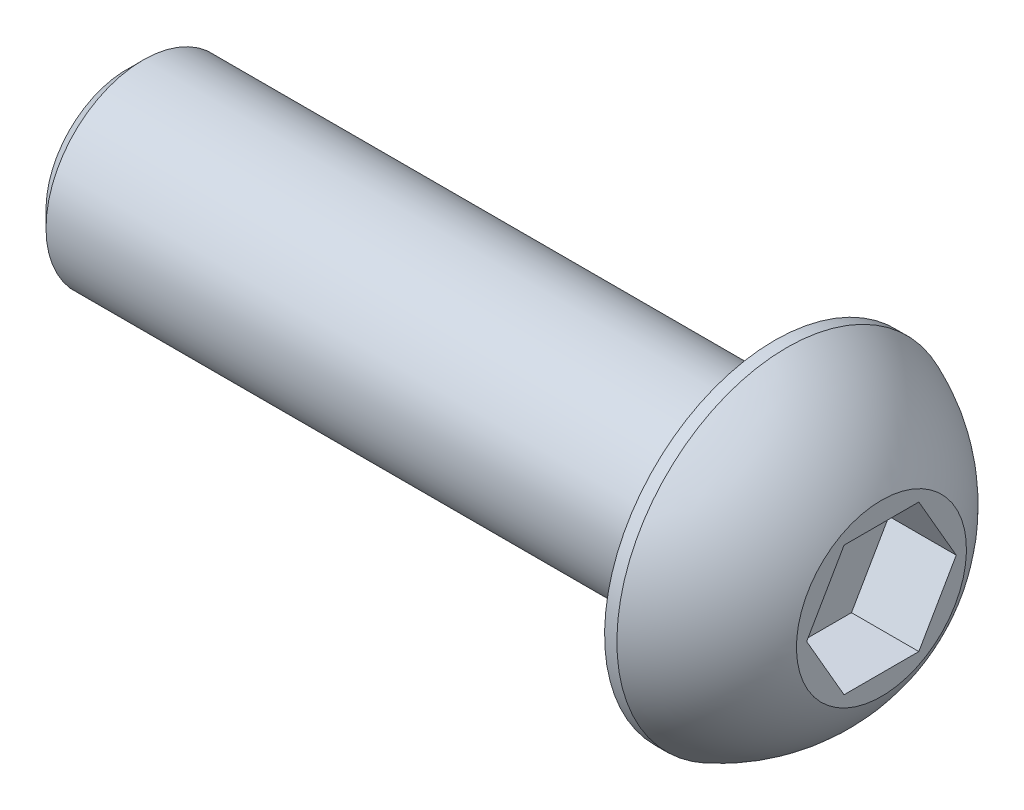
ISO-10303-21;
HEADER;
FILE_DESCRIPTION(('STEP AP214'),'2;1');
FILE_NAME('part.step','',(''),(''),'','','');
FILE_SCHEMA(('AUTOMOTIVE_DESIGN { 1 0 10303 214 1 1 1 1 }'));
ENDSEC;
DATA;
#1=APPLICATION_CONTEXT('core data for automotive mechanical design processes');
#2=APPLICATION_PROTOCOL_DEFINITION('international standard','automotive_design',2000,#1);
#3=PRODUCT_CONTEXT('',#1,'mechanical');
#4=PRODUCT('Part','Part','',(#3));
#5=PRODUCT_RELATED_PRODUCT_CATEGORY('part','',(#4));
#6=PRODUCT_DEFINITION_FORMATION('','',#4);
#7=PRODUCT_DEFINITION_CONTEXT('part definition',#1,'design');
#8=PRODUCT_DEFINITION('design','',#6,#7);
#9=PRODUCT_DEFINITION_SHAPE('','',#8);
#10=(LENGTH_UNIT() NAMED_UNIT(*) SI_UNIT(.MILLI.,.METRE.));
#11=(NAMED_UNIT(*) PLANE_ANGLE_UNIT() SI_UNIT($,.RADIAN.));
#12=(NAMED_UNIT(*) SI_UNIT($,.STERADIAN.) SOLID_ANGLE_UNIT());
#13=UNCERTAINTY_MEASURE_WITH_UNIT(LENGTH_MEASURE(1.E-05),#10,'distance_accuracy_value','');
#14=(GEOMETRIC_REPRESENTATION_CONTEXT(3) GLOBAL_UNCERTAINTY_ASSIGNED_CONTEXT((#13)) GLOBAL_UNIT_ASSIGNED_CONTEXT((#10,
#11,#12)) REPRESENTATION_CONTEXT('',''));
#15=CARTESIAN_POINT('',(0.,0.,0.));
#16=DIRECTION('',(0.,0.,1.));
#17=DIRECTION('',(1.,0.,0.));
#18=AXIS2_PLACEMENT_3D('',#15,#16,#17);
#19=CARTESIAN_POINT('',(0.,0.,0.));
#20=DIRECTION('',(1.,0.,0.));
#21=DIRECTION('',(0.,1.,0.));
#22=AXIS2_PLACEMENT_3D('',#19,#20,#21);
#23=PLANE('',#22);
#24=DIRECTION('',(0.,0.866025403784439,-0.5));
#25=VECTOR('',#24,1.);
#26=CARTESIAN_POINT('',(0.,-2.,-1.15470053837925));
#27=LINE('',#26,#25);
#28=CARTESIAN_POINT('',(0.,-2.,-1.15470053837925));
#29=VERTEX_POINT('',#28);
#30=CARTESIAN_POINT('',(0.,0.,-2.3094010767585));
#31=VERTEX_POINT('',#30);
#32=EDGE_CURVE('E49',#29,#31,#27,.T.);
#33=ORIENTED_EDGE('',*,*,#32,.F.);
#34=DIRECTION('',(0.,0.,-1.));
#35=VECTOR('',#34,1.);
#36=CARTESIAN_POINT('',(0.,-2.,1.15470053837925));
#37=LINE('',#36,#35);
#38=CARTESIAN_POINT('',(0.,-2.,1.15470053837925));
#39=VERTEX_POINT('',#38);
#40=EDGE_CURVE('E132',#39,#29,#37,.T.);
#41=ORIENTED_EDGE('',*,*,#40,.F.);
#42=DIRECTION('',(0.,-0.866025403784439,-0.5));
#43=VECTOR('',#42,1.);
#44=CARTESIAN_POINT('',(0.,0.,2.3094010767585));
#45=LINE('',#44,#43);
#46=CARTESIAN_POINT('',(0.,0.,2.3094010767585));
#47=VERTEX_POINT('',#46);
#48=EDGE_CURVE('E130',#47,#39,#45,.T.);
#49=ORIENTED_EDGE('',*,*,#48,.F.);
#50=DIRECTION('',(0.,-0.866025403784439,0.5));
#51=VECTOR('',#50,1.);
#52=CARTESIAN_POINT('',(0.,2.,1.15470053837925));
#53=LINE('',#52,#51);
#54=CARTESIAN_POINT('',(0.,2.,1.15470053837925));
#55=VERTEX_POINT('',#54);
#56=EDGE_CURVE('E97',#55,#47,#53,.T.);
#57=ORIENTED_EDGE('',*,*,#56,.F.);
#58=DIRECTION('',(0.,0.,1.));
#59=VECTOR('',#58,1.);
#60=CARTESIAN_POINT('',(0.,2.,-1.15470053837925));
#61=LINE('',#60,#59);
#62=CARTESIAN_POINT('',(0.,2.,-1.15470053837925));
#63=VERTEX_POINT('',#62);
#64=EDGE_CURVE('E126',#63,#55,#61,.T.);
#65=ORIENTED_EDGE('',*,*,#64,.F.);
#66=DIRECTION('',(0.,0.866025403784438,0.5));
#67=VECTOR('',#66,1.);
#68=CARTESIAN_POINT('',(0.,0.,-2.3094010767585));
#69=LINE('',#68,#67);
#70=EDGE_CURVE('E123',#31,#63,#69,.T.);
#71=ORIENTED_EDGE('',*,*,#70,.F.);
#72=EDGE_LOOP('',(#33,#41,#49,#57,#65,#71));
#73=FACE_BOUND('',#72,.T.);
#74=CARTESIAN_POINT('',(0.,0.,0.));
#75=DIRECTION('',(1.,0.,0.));
#76=DIRECTION('',(0.,1.,0.));
#77=AXIS2_PLACEMENT_3D('',#74,#75,#76);
#78=CIRCLE('',#77,2.625);
#79=CARTESIAN_POINT('',(0.,2.625,0.));
#80=VERTEX_POINT('',#79);
#81=EDGE_CURVE('E150',#80,#80,#78,.T.);
#82=ORIENTED_EDGE('',*,*,#81,.T.);
#83=EDGE_LOOP('',(#82));
#84=FACE_BOUND('',#83,.T.);
#85=ADVANCED_FACE('F34',(#73,#84),#23,.T.);
#86=CARTESIAN_POINT('',(-4.99970462328767,0.,0.));
#87=DIRECTION('',(1.,0.,0.));
#88=DIRECTION('',(0.,1.,0.));
#89=AXIS2_PLACEMENT_3D('',#86,#87,#88);
#90=SPHERICAL_SURFACE('',#89,5.64691697478581);
#91=CARTESIAN_POINT('',(-2.92,0.,0.));
#92=DIRECTION('',(1.,0.,0.));
#93=DIRECTION('',(0.,1.,0.));
#94=AXIS2_PLACEMENT_3D('',#91,#92,#93);
#95=CIRCLE('',#94,5.25);
#96=CARTESIAN_POINT('',(-2.92,5.25,0.));
#97=VERTEX_POINT('',#96);
#98=EDGE_CURVE('E147',#97,#97,#95,.T.);
#99=CARTESIAN_POINT('',(-2.92,5.25,0.));
#100=CARTESIAN_POINT('',(-2.88116333139993,5.23461555496798,0.));
#101=CARTESIAN_POINT('',(-2.84249743445724,5.21880002304115,0.));
#102=CARTESIAN_POINT('',(-2.76552608609883,5.18631490596423,0.));
#103=CARTESIAN_POINT('',(-2.72722063468312,5.16964532081416,0.));
#104=CARTESIAN_POINT('',(-2.65098907959087,5.13546021785716,0.));
#105=CARTESIAN_POINT('',(-2.61306297591435,5.11794470005024,0.));
#106=CARTESIAN_POINT('',(-2.5376087841269,5.08207638165227,0.));
#107=CARTESIAN_POINT('',(-2.50008069601598,5.06372358106121,0.));
#108=CARTESIAN_POINT('',(-2.42544101991594,5.02618972911532,0.));
#109=CARTESIAN_POINT('',(-2.38832943192682,5.00700867776048,0.));
#110=CARTESIAN_POINT('',(-2.31454103209333,4.9678277722965,0.));
#111=CARTESIAN_POINT('',(-2.27786422024896,4.94782791818736,0.));
#112=CARTESIAN_POINT('',(-2.204963435524,4.90701925630077,0.));
#113=CARTESIAN_POINT('',(-2.16873946264342,4.88621044852334,0.));
#114=CARTESIAN_POINT('',(-2.09676219540545,4.84379412736126,0.));
#115=CARTESIAN_POINT('',(-2.06100890104806,4.82218661397662,0.));
#116=CARTESIAN_POINT('',(-1.9899905986814,4.77818352285276,0.));
#117=CARTESIAN_POINT('',(-1.95472559067213,4.75578794511354,0.));
#118=CARTESIAN_POINT('',(-1.88470122833741,4.71021975468139,0.));
#119=CARTESIAN_POINT('',(-1.84994187401195,4.68704714198848,0.));
#120=CARTESIAN_POINT('',(-1.78094593736053,4.63993629371345,0.));
#121=CARTESIAN_POINT('',(-1.74670935503456,4.61599805813134,0.));
#122=CARTESIAN_POINT('',(-1.67877582324134,4.56736775320002,0.));
#123=CARTESIAN_POINT('',(-1.6450788737741,4.54267568385081,0.));
#124=CARTESIAN_POINT('',(-1.57824120279908,4.4925498717552,0.));
#125=CARTESIAN_POINT('',(-1.5451004812913,4.4671161290088,0.));
#126=CARTESIAN_POINT('',(-1.4793915874043,4.4155194957489,0.));
#127=CARTESIAN_POINT('',(-1.44682341502507,4.38935660523539,0.));
#128=CARTESIAN_POINT('',(-1.3822756585948,4.33631456116252,0.));
#129=CARTESIAN_POINT('',(-1.35029607454375,4.30943540760316,0.));
#130=CARTESIAN_POINT('',(-1.28694124410103,4.2549740749057,0.));
#131=CARTESIAN_POINT('',(-1.25556599770935,4.22739189576759,0.));
#132=CARTESIAN_POINT('',(-1.19343529429185,4.17153809560631,0.));
#133=CARTESIAN_POINT('',(-1.16267983726602,4.14326647458313,0.));
#134=CARTESIAN_POINT('',(-1.10180385905236,4.0860477138823,0.));
#135=CARTESIAN_POINT('',(-1.07168333786451,4.05710057420464,0.));
#136=CARTESIAN_POINT('',(-1.01209206510522,3.99854503210538,0.));
#137=CARTESIAN_POINT('',(-0.982621313533777,3.96893662968379,0.));
#138=CARTESIAN_POINT('',(-0.924344093786624,3.90907314366641,0.));
#139=CARTESIAN_POINT('',(-0.895537625610918,3.87881806007063,0.));
#140=CARTESIAN_POINT('',(-0.838603159287821,3.8176761117527,0.));
#141=CARTESIAN_POINT('',(-0.810475161140431,3.78678924703054,0.));
#142=CARTESIAN_POINT('',(-0.754911487372876,3.72439894764781,0.));
#143=CARTESIAN_POINT('',(-0.727475811752712,3.69289551298725,0.));
#144=CARTESIAN_POINT('',(-0.67331029458373,3.62928758856413,0.));
#145=CARTESIAN_POINT('',(-0.646580453034913,3.59718309880158,0.));
#146=CARTESIAN_POINT('',(-0.593839767940168,3.53238887502059,0.));
#147=CARTESIAN_POINT('',(-0.567828924394241,3.49969914100215,0.));
#148=CARTESIAN_POINT('',(-0.516539045154724,3.43375052777114,0.));
#149=CARTESIAN_POINT('',(-0.491260009461134,3.40049164855857,0.));
#150=CARTESIAN_POINT('',(-0.441446195334814,3.33342112431611,0.));
#151=CARTESIAN_POINT('',(-0.416911416902083,3.29960947928621,0.));
#152=CARTESIAN_POINT('',(-0.368598200321403,3.23145007493057,0.));
#153=CARTESIAN_POINT('',(-0.344819762173455,3.19710231560482,0.));
#154=CARTESIAN_POINT('',(-0.298030936151541,3.12788759851044,0.));
#155=CARTESIAN_POINT('',(-0.275020548277576,3.09302064074179,0.));
#156=CARTESIAN_POINT('',(-0.229779156601616,3.02278469716988,0.));
#157=CARTESIAN_POINT('',(-0.20754815279962,2.98741571136661,0.));
#158=CARTESIAN_POINT('',(-0.16387647155035,2.91619313362712,0.));
#159=CARTESIAN_POINT('',(-0.142435794103075,2.8803395416909,0.));
#160=CARTESIAN_POINT('',(-0.100355347300804,2.80816539636944,0.));
#161=CARTESIAN_POINT('',(-0.0797155779458063,2.7718448429842,0.));
#162=CARTESIAN_POINT('',(-0.039247027615892,2.69875470867178,0.));
#163=CARTESIAN_POINT('',(-0.0194182466409751,2.6619851277446,0.));
#164=CARTESIAN_POINT('',(0.,2.625,0.));
#165=B_SPLINE_CURVE_WITH_KNOTS('',3,(#99,#100,#101,#102,#103,#104,#105,#106,#107,#108,#109,#110,
#111,#112,#113,#114,#115,#116,#117,#118,#119,#120,#121,#122,#123,#124,#125,#126,#127,#128,#129,
#130,#131,#132,#133,#134,#135,#136,#137,#138,#139,#140,#141,#142,#143,#144,#145,#146,#147,#148,
#149,#150,#151,#152,#153,#154,#155,#156,#157,#158,#159,#160,#161,#162,#163,#164),.UNSPECIFIED.,
.F.,.F.,(4,2,2,2,2,2,2,2,2,2,2,2,2,2,2,2,2,2,2,2,2,2,2,2,2,2,2,2,2,2,2,2,4),(0.,
0.12531586463099,0.25063172926198,0.37594759389297,0.501263458523959,0.626579323154949,
0.751895187785939,0.877211052416929,1.00252691704792,1.12784278167891,1.2531586463099,
1.37847451094089,1.50379037557188,1.62910624020287,1.75442210483386,1.87973796946485,
2.00505383409584,2.13036969872683,2.25568556335782,2.38100142798881,2.5063172926198,
2.63163315725079,2.75694902188178,2.88226488651277,3.00758075114376,3.13289661577475,
3.25821248040574,3.38352834503673,3.50884420966772,3.63416007429871,3.7594759389297,
3.88479180356069,4.01010766819168),.UNSPECIFIED.);
#166=EDGE_CURVE('BSEAM167',#97,#80,#165,.T.);
#167=ORIENTED_EDGE('',*,*,#98,.T.);
#168=ORIENTED_EDGE('',*,*,#81,.F.);
#169=ORIENTED_EDGE('',*,*,#166,.T.);
#170=ORIENTED_EDGE('',*,*,#166,.F.);
#171=EDGE_LOOP('',(#167,#169,#168,#170));
#172=FACE_BOUND('',#171,.T.);
#173=ADVANCED_FACE('F167',(#172),#90,.T.);
#174=CARTESIAN_POINT('',(0.,0.,0.));
#175=DIRECTION('',(1.,0.,0.));
#176=DIRECTION('',(0.,1.,0.));
#177=AXIS2_PLACEMENT_3D('',#174,#175,#176);
#178=CYLINDRICAL_SURFACE('',#177,5.25);
#179=CARTESIAN_POINT('',(-3.3,0.,0.));
#180=DIRECTION('',(1.,0.,0.));
#181=DIRECTION('',(0.,1.,0.));
#182=AXIS2_PLACEMENT_3D('',#179,#180,#181);
#183=CIRCLE('',#182,5.25);
#184=CARTESIAN_POINT('',(-3.3,5.25,0.));
#185=VERTEX_POINT('',#184);
#186=EDGE_CURVE('E144',#185,#185,#183,.T.);
#187=ORIENTED_EDGE('',*,*,#186,.T.);
#188=EDGE_LOOP('',(#187));
#189=FACE_BOUND('',#188,.T.);
#190=ORIENTED_EDGE('',*,*,#98,.F.);
#191=EDGE_LOOP('',(#190));
#192=FACE_BOUND('',#191,.T.);
#193=ADVANCED_FACE('F172',(#189,#192),#178,.T.);
#194=CARTESIAN_POINT('',(-3.3,5.25,0.));
#195=DIRECTION('',(-1.,0.,0.));
#196=DIRECTION('',(0.,-1.,0.));
#197=AXIS2_PLACEMENT_3D('',#194,#195,#196);
#198=PLANE('',#197);
#199=CARTESIAN_POINT('',(-3.3,0.,0.));
#200=DIRECTION('',(1.,0.,0.));
#201=DIRECTION('',(0.,1.,0.));
#202=AXIS2_PLACEMENT_3D('',#199,#200,#201);
#203=CIRCLE('',#202,3.);
#204=CARTESIAN_POINT('',(-3.3,3.,0.));
#205=VERTEX_POINT('',#204);
#206=EDGE_CURVE('E136',#205,#205,#203,.T.);
#207=ORIENTED_EDGE('',*,*,#206,.T.);
#208=EDGE_LOOP('',(#207));
#209=FACE_BOUND('',#208,.T.);
#210=ORIENTED_EDGE('',*,*,#186,.F.);
#211=EDGE_LOOP('',(#210));
#212=FACE_BOUND('',#211,.T.);
#213=ADVANCED_FACE('F179',(#209,#212),#198,.T.);
#214=CARTESIAN_POINT('',(0.,0.,0.));
#215=DIRECTION('',(1.,0.,0.));
#216=DIRECTION('',(0.,1.,0.));
#217=AXIS2_PLACEMENT_3D('',#214,#215,#216);
#218=CYLINDRICAL_SURFACE('',#217,3.);
#219=CARTESIAN_POINT('',(-22.8,0.,0.));
#220=DIRECTION('',(-1.,0.,0.));
#221=DIRECTION('',(0.,-1.,0.));
#222=AXIS2_PLACEMENT_3D('',#219,#220,#221);
#223=CIRCLE('',#222,3.);
#224=CARTESIAN_POINT('',(-22.8,-3.,0.));
#225=VERTEX_POINT('',#224);
#226=EDGE_CURVE('E42',#225,#225,#223,.F.);
#227=ORIENTED_EDGE('',*,*,#226,.T.);
#228=EDGE_LOOP('',(#227));
#229=FACE_BOUND('',#228,.T.);
#230=ORIENTED_EDGE('',*,*,#206,.F.);
#231=EDGE_LOOP('',(#230));
#232=FACE_BOUND('',#231,.T.);
#233=ADVANCED_FACE('F155',(#229,#232),#218,.T.);
#234=CARTESIAN_POINT('',(-23.3,3.,0.));
#235=DIRECTION('',(-1.,0.,0.));
#236=DIRECTION('',(0.,-1.,0.));
#237=AXIS2_PLACEMENT_3D('',#234,#235,#236);
#238=PLANE('',#237);
#239=CARTESIAN_POINT('',(-23.3,0.,0.));
#240=DIRECTION('',(-1.,0.,0.));
#241=DIRECTION('',(0.,-1.,0.));
#242=AXIS2_PLACEMENT_3D('',#239,#240,#241);
#243=CIRCLE('',#242,2.5);
#244=CARTESIAN_POINT('',(-23.3,-2.5,0.));
#245=VERTEX_POINT('',#244);
#246=EDGE_CURVE('E11',#245,#245,#243,.T.);
#247=ORIENTED_EDGE('',*,*,#246,.T.);
#248=EDGE_LOOP('',(#247));
#249=FACE_BOUND('',#248,.T.);
#250=ADVANCED_FACE('F186',(#249),#238,.T.);
#251=CARTESIAN_POINT('',(-2.08,-2.,-1.15470053837925));
#252=DIRECTION('',(0.,-0.5,-0.866025403784439));
#253=DIRECTION('',(0.,0.866025403784439,-0.5));
#254=AXIS2_PLACEMENT_3D('',#251,#252,#253);
#255=PLANE('',#254);
#256=ORIENTED_EDGE('',*,*,#32,.T.);
#257=DIRECTION('',(1.,0.,0.));
#258=VECTOR('',#257,1.);
#259=CARTESIAN_POINT('',(-2.08,0.,-2.3094010767585));
#260=LINE('',#259,#258);
#261=CARTESIAN_POINT('',(-2.08,0.,-2.3094010767585));
#262=VERTEX_POINT('',#261);
#263=EDGE_CURVE('E79',#262,#31,#260,.T.);
#264=ORIENTED_EDGE('',*,*,#263,.F.);
#265=DIRECTION('',(0.,0.866025403784439,-0.5));
#266=VECTOR('',#265,1.);
#267=CARTESIAN_POINT('',(-2.08,-2.,-1.15470053837925));
#268=LINE('',#267,#266);
#269=CARTESIAN_POINT('',(-2.08,-2.,-1.15470053837925));
#270=VERTEX_POINT('',#269);
#271=EDGE_CURVE('E134',#270,#262,#268,.T.);
#272=ORIENTED_EDGE('',*,*,#271,.F.);
#273=DIRECTION('',(1.,0.,0.));
#274=VECTOR('',#273,1.);
#275=CARTESIAN_POINT('',(-2.08,-2.,-1.15470053837925));
#276=LINE('',#275,#274);
#277=EDGE_CURVE('E57',#270,#29,#276,.T.);
#278=ORIENTED_EDGE('',*,*,#277,.T.);
#279=EDGE_LOOP('',(#256,#264,#272,#278));
#280=FACE_BOUND('',#279,.T.);
#281=ADVANCED_FACE('F189',(#280),#255,.F.);
#282=CARTESIAN_POINT('',(-2.08,-2.,1.15470053837925));
#283=DIRECTION('',(0.,-1.,0.));
#284=DIRECTION('',(0.,0.,-1.));
#285=AXIS2_PLACEMENT_3D('',#282,#283,#284);
#286=PLANE('',#285);
#287=ORIENTED_EDGE('',*,*,#40,.T.);
#288=ORIENTED_EDGE('',*,*,#277,.F.);
#289=DIRECTION('',(0.,0.,-1.));
#290=VECTOR('',#289,1.);
#291=CARTESIAN_POINT('',(-2.08,-2.,1.15470053837925));
#292=LINE('',#291,#290);
#293=CARTESIAN_POINT('',(-2.08,-2.,1.15470053837925));
#294=VERTEX_POINT('',#293);
#295=EDGE_CURVE('E109',#294,#270,#292,.T.);
#296=ORIENTED_EDGE('',*,*,#295,.F.);
#297=DIRECTION('',(1.,0.,0.));
#298=VECTOR('',#297,1.);
#299=CARTESIAN_POINT('',(-2.08,-2.,1.15470053837925));
#300=LINE('',#299,#298);
#301=EDGE_CURVE('E101',#294,#39,#300,.T.);
#302=ORIENTED_EDGE('',*,*,#301,.T.);
#303=EDGE_LOOP('',(#287,#288,#296,#302));
#304=FACE_BOUND('',#303,.T.);
#305=ADVANCED_FACE('F193',(#304),#286,.F.);
#306=CARTESIAN_POINT('',(-2.08,0.,2.3094010767585));
#307=DIRECTION('',(0.,-0.5,0.866025403784439));
#308=DIRECTION('',(0.,-0.866025403784439,-0.5));
#309=AXIS2_PLACEMENT_3D('',#306,#307,#308);
#310=PLANE('',#309);
#311=ORIENTED_EDGE('',*,*,#48,.T.);
#312=ORIENTED_EDGE('',*,*,#301,.F.);
#313=DIRECTION('',(0.,-0.866025403784439,-0.5));
#314=VECTOR('',#313,1.);
#315=CARTESIAN_POINT('',(-2.08,0.,2.3094010767585));
#316=LINE('',#315,#314);
#317=CARTESIAN_POINT('',(-2.08,0.,2.3094010767585));
#318=VERTEX_POINT('',#317);
#319=EDGE_CURVE('E105',#318,#294,#316,.T.);
#320=ORIENTED_EDGE('',*,*,#319,.F.);
#321=DIRECTION('',(1.,0.,0.));
#322=VECTOR('',#321,1.);
#323=CARTESIAN_POINT('',(-2.08,0.,2.3094010767585));
#324=LINE('',#323,#322);
#325=EDGE_CURVE('E90',#318,#47,#324,.T.);
#326=ORIENTED_EDGE('',*,*,#325,.T.);
#327=EDGE_LOOP('',(#311,#312,#320,#326));
#328=FACE_BOUND('',#327,.T.);
#329=ADVANCED_FACE('F106',(#328),#310,.F.);
#330=CARTESIAN_POINT('',(-2.08,2.,1.15470053837925));
#331=DIRECTION('',(0.,0.5,0.866025403784439));
#332=DIRECTION('',(0.,-0.866025403784439,0.5));
#333=AXIS2_PLACEMENT_3D('',#330,#331,#332);
#334=PLANE('',#333);
#335=ORIENTED_EDGE('',*,*,#56,.T.);
#336=ORIENTED_EDGE('',*,*,#325,.F.);
#337=DIRECTION('',(0.,-0.866025403784439,0.5));
#338=VECTOR('',#337,1.);
#339=CARTESIAN_POINT('',(-2.08,2.,1.15470053837925));
#340=LINE('',#339,#338);
#341=CARTESIAN_POINT('',(-2.08,2.,1.15470053837925));
#342=VERTEX_POINT('',#341);
#343=EDGE_CURVE('E94',#342,#318,#340,.T.);
#344=ORIENTED_EDGE('',*,*,#343,.F.);
#345=DIRECTION('',(1.,0.,0.));
#346=VECTOR('',#345,1.);
#347=CARTESIAN_POINT('',(-2.08,2.,1.15470053837925));
#348=LINE('',#347,#346);
#349=EDGE_CURVE('E102',#342,#55,#348,.T.);
#350=ORIENTED_EDGE('',*,*,#349,.T.);
#351=EDGE_LOOP('',(#335,#336,#344,#350));
#352=FACE_BOUND('',#351,.T.);
#353=ADVANCED_FACE('F92',(#352),#334,.F.);
#354=CARTESIAN_POINT('',(-2.08,2.,-1.15470053837925));
#355=DIRECTION('',(0.,1.,0.));
#356=DIRECTION('',(-1.,0.,0.));
#357=AXIS2_PLACEMENT_3D('',#354,#355,#356);
#358=PLANE('',#357);
#359=ORIENTED_EDGE('',*,*,#64,.T.);
#360=ORIENTED_EDGE('',*,*,#349,.F.);
#361=DIRECTION('',(0.,0.,1.));
#362=VECTOR('',#361,1.);
#363=CARTESIAN_POINT('',(-2.08,2.,-1.15470053837925));
#364=LINE('',#363,#362);
#365=CARTESIAN_POINT('',(-2.08,2.,-1.15470053837925));
#366=VERTEX_POINT('',#365);
#367=EDGE_CURVE('E115',#366,#342,#364,.T.);
#368=ORIENTED_EDGE('',*,*,#367,.F.);
#369=DIRECTION('',(1.,0.,0.));
#370=VECTOR('',#369,1.);
#371=CARTESIAN_POINT('',(-2.08,2.,-1.15470053837925));
#372=LINE('',#371,#370);
#373=EDGE_CURVE('E139',#366,#63,#372,.T.);
#374=ORIENTED_EDGE('',*,*,#373,.T.);
#375=EDGE_LOOP('',(#359,#360,#368,#374));
#376=FACE_BOUND('',#375,.T.);
#377=ADVANCED_FACE('F196',(#376),#358,.F.);
#378=CARTESIAN_POINT('',(-2.08,0.,-2.3094010767585));
#379=DIRECTION('',(0.,0.5,-0.866025403784438));
#380=DIRECTION('',(0.,0.866025403784439,0.5));
#381=AXIS2_PLACEMENT_3D('',#378,#379,#380);
#382=PLANE('',#381);
#383=ORIENTED_EDGE('',*,*,#70,.T.);
#384=ORIENTED_EDGE('',*,*,#373,.F.);
#385=DIRECTION('',(0.,0.866025403784438,0.5));
#386=VECTOR('',#385,1.);
#387=CARTESIAN_POINT('',(-2.08,0.,-2.3094010767585));
#388=LINE('',#387,#386);
#389=EDGE_CURVE('E117',#262,#366,#388,.T.);
#390=ORIENTED_EDGE('',*,*,#389,.F.);
#391=ORIENTED_EDGE('',*,*,#263,.T.);
#392=EDGE_LOOP('',(#383,#384,#390,#391));
#393=FACE_BOUND('',#392,.T.);
#394=ADVANCED_FACE('F163',(#393),#382,.F.);
#395=CARTESIAN_POINT('',(-2.08,0.,-2.3094010767585));
#396=DIRECTION('',(1.,0.,0.));
#397=DIRECTION('',(0.,1.,0.));
#398=AXIS2_PLACEMENT_3D('',#395,#396,#397);
#399=PLANE('',#398);
#400=ORIENTED_EDGE('',*,*,#271,.T.);
#401=ORIENTED_EDGE('',*,*,#389,.T.);
#402=ORIENTED_EDGE('',*,*,#367,.T.);
#403=ORIENTED_EDGE('',*,*,#343,.T.);
#404=ORIENTED_EDGE('',*,*,#319,.T.);
#405=ORIENTED_EDGE('',*,*,#295,.T.);
#406=EDGE_LOOP('',(#400,#401,#402,#403,#404,#405));
#407=FACE_BOUND('',#406,.T.);
#408=ADVANCED_FACE('F112',(#407),#399,.T.);
#409=CARTESIAN_POINT('',(-22.8,0.,0.));
#410=DIRECTION('',(1.,0.,0.));
#411=DIRECTION('',(0.,1.,0.));
#412=AXIS2_PLACEMENT_3D('',#409,#410,#411);
#413=CONICAL_SURFACE('',#412,3.,0.785398163397449);
#414=ORIENTED_EDGE('',*,*,#246,.F.);
#415=EDGE_LOOP('',(#414));
#416=FACE_BOUND('',#415,.T.);
#417=ORIENTED_EDGE('',*,*,#226,.F.);
#418=EDGE_LOOP('',(#417));
#419=FACE_BOUND('',#418,.T.);
#420=ADVANCED_FACE('F36',(#416,#419),#413,.T.);
#421=CLOSED_SHELL('',(#85,#173,#193,#213,#233,#250,#281,#305,#329,#353,#377,#394,#408,#420));
#422=MANIFOLD_SOLID_BREP('B2',#421);
#423=ADVANCED_BREP_SHAPE_REPRESENTATION('',(#18,#422),#14);
#424=SHAPE_DEFINITION_REPRESENTATION(#9,#423);
ENDSEC;
END-ISO-10303-21;
